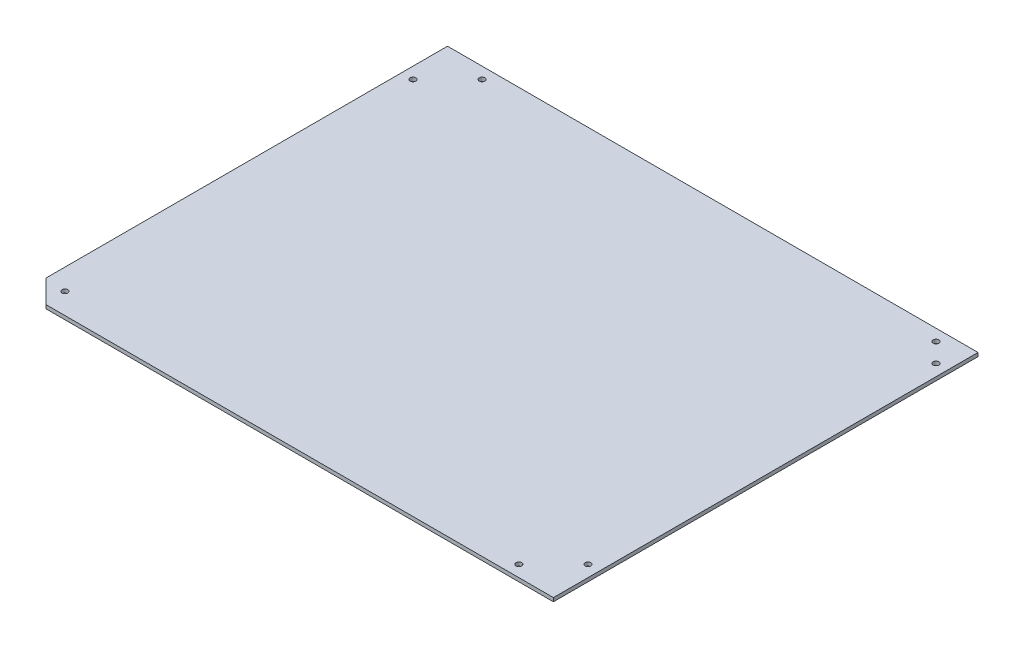
ISO-10303-21;
HEADER;
FILE_DESCRIPTION(('STEP AP214'),'2;1');
FILE_NAME('part.step','',(''),(''),'','','');
FILE_SCHEMA(('AUTOMOTIVE_DESIGN { 1 0 10303 214 1 1 1 1 }'));
ENDSEC;
DATA;
#1=APPLICATION_CONTEXT('core data for automotive mechanical design processes');
#2=APPLICATION_PROTOCOL_DEFINITION('international standard','automotive_design',2000,#1);
#3=PRODUCT_CONTEXT('',#1,'mechanical');
#4=PRODUCT('Part','Part','',(#3));
#5=PRODUCT_RELATED_PRODUCT_CATEGORY('part','',(#4));
#6=PRODUCT_DEFINITION_FORMATION('','',#4);
#7=PRODUCT_DEFINITION_CONTEXT('part definition',#1,'design');
#8=PRODUCT_DEFINITION('design','',#6,#7);
#9=PRODUCT_DEFINITION_SHAPE('','',#8);
#10=(LENGTH_UNIT() NAMED_UNIT(*) SI_UNIT(.MILLI.,.METRE.));
#11=(NAMED_UNIT(*) PLANE_ANGLE_UNIT() SI_UNIT($,.RADIAN.));
#12=(NAMED_UNIT(*) SI_UNIT($,.STERADIAN.) SOLID_ANGLE_UNIT());
#13=UNCERTAINTY_MEASURE_WITH_UNIT(LENGTH_MEASURE(1.E-05),#10,'distance_accuracy_value','');
#14=(GEOMETRIC_REPRESENTATION_CONTEXT(3) GLOBAL_UNCERTAINTY_ASSIGNED_CONTEXT((#13)) GLOBAL_UNIT_ASSIGNED_CONTEXT((#10,
#11,#12)) REPRESENTATION_CONTEXT('',''));
#15=CARTESIAN_POINT('',(0.,0.,0.));
#16=DIRECTION('',(0.,0.,1.));
#17=DIRECTION('',(1.,0.,0.));
#18=AXIS2_PLACEMENT_3D('',#15,#16,#17);
#19=CARTESIAN_POINT('',(-295.,446.825,-128.396227551465));
#20=DIRECTION('',(1.,0.,0.));
#21=DIRECTION('',(0.,0.,-1.));
#22=AXIS2_PLACEMENT_3D('',#19,#20,#21);
#23=PLANE('',#22);
#24=DIRECTION('',(0.,0.,-1.));
#25=VECTOR('',#24,1.);
#26=CARTESIAN_POINT('',(-295.,446.825,-128.396227551465));
#27=LINE('',#26,#25);
#28=CARTESIAN_POINT('',(-295.,446.825,220.));
#29=VERTEX_POINT('',#28);
#30=CARTESIAN_POINT('',(-295.,446.825,-128.396227551465));
#31=VERTEX_POINT('',#30);
#32=EDGE_CURVE('E81',#29,#31,#27,.T.);
#33=ORIENTED_EDGE('',*,*,#32,.F.);
#34=DIRECTION('',(0.,1.,0.));
#35=VECTOR('',#34,1.);
#36=CARTESIAN_POINT('',(-295.,446.825,220.));
#37=LINE('',#36,#35);
#38=CARTESIAN_POINT('',(-295.,450.,220.));
#39=VERTEX_POINT('',#38);
#40=EDGE_CURVE('E104',#29,#39,#37,.T.);
#41=ORIENTED_EDGE('',*,*,#40,.T.);
#42=DIRECTION('',(0.,0.,-1.));
#43=VECTOR('',#42,1.);
#44=CARTESIAN_POINT('',(-295.,450.,-128.396227551465));
#45=LINE('',#44,#43);
#46=CARTESIAN_POINT('',(-295.,450.,-128.396227551465));
#47=VERTEX_POINT('',#46);
#48=EDGE_CURVE('E102',#39,#47,#45,.T.);
#49=ORIENTED_EDGE('',*,*,#48,.T.);
#50=DIRECTION('',(0.,1.,0.));
#51=VECTOR('',#50,1.);
#52=CARTESIAN_POINT('',(-295.,446.825,-128.396227551465));
#53=LINE('',#52,#51);
#54=EDGE_CURVE('E96',#31,#47,#53,.T.);
#55=ORIENTED_EDGE('',*,*,#54,.F.);
#56=EDGE_LOOP('',(#33,#41,#49,#55));
#57=FACE_BOUND('',#56,.T.);
#58=ADVANCED_FACE('F33',(#57),#23,.F.);
#59=CARTESIAN_POINT('',(-295.,446.825,-128.396227551465));
#60=DIRECTION('',(0.,0.,1.));
#61=DIRECTION('',(1.,0.,0.));
#62=AXIS2_PLACEMENT_3D('',#59,#60,#61);
#63=PLANE('',#62);
#64=DIRECTION('',(1.,0.,0.));
#65=VECTOR('',#64,1.);
#66=CARTESIAN_POINT('',(-295.,450.,-128.396227551465));
#67=LINE('',#66,#65);
#68=CARTESIAN_POINT('',(165.271732748,450.,-128.396227551465));
#69=VERTEX_POINT('',#68);
#70=EDGE_CURVE('E153',#47,#69,#67,.T.);
#71=ORIENTED_EDGE('',*,*,#70,.T.);
#72=DIRECTION('',(0.,1.,0.));
#73=VECTOR('',#72,1.);
#74=CARTESIAN_POINT('',(165.271732748,446.825,-128.396227551465));
#75=LINE('',#74,#73);
#76=CARTESIAN_POINT('',(165.271732748,446.825,-128.396227551465));
#77=VERTEX_POINT('',#76);
#78=EDGE_CURVE('E98',#77,#69,#75,.T.);
#79=ORIENTED_EDGE('',*,*,#78,.F.);
#80=DIRECTION('',(1.,0.,0.));
#81=VECTOR('',#80,1.);
#82=CARTESIAN_POINT('',(-295.,446.825,-128.396227551465));
#83=LINE('',#82,#81);
#84=EDGE_CURVE('E84',#31,#77,#83,.T.);
#85=ORIENTED_EDGE('',*,*,#84,.F.);
#86=ORIENTED_EDGE('',*,*,#54,.T.);
#87=EDGE_LOOP('',(#71,#79,#85,#86));
#88=FACE_BOUND('',#87,.T.);
#89=ADVANCED_FACE('F95',(#88),#63,.F.);
#90=CARTESIAN_POINT('',(165.271732748,446.825,-128.396227551465));
#91=DIRECTION('',(-1.,0.,0.));
#92=DIRECTION('',(0.,0.,1.));
#93=AXIS2_PLACEMENT_3D('',#90,#91,#92);
#94=PLANE('',#93);
#95=DIRECTION('',(0.,0.,1.));
#96=VECTOR('',#95,1.);
#97=CARTESIAN_POINT('',(165.271732748,450.,-128.396227551465));
#98=LINE('',#97,#96);
#99=CARTESIAN_POINT('',(165.271732748,450.,240.));
#100=VERTEX_POINT('',#99);
#101=EDGE_CURVE('E155',#69,#100,#98,.T.);
#102=ORIENTED_EDGE('',*,*,#101,.T.);
#103=DIRECTION('',(0.,1.,0.));
#104=VECTOR('',#103,1.);
#105=CARTESIAN_POINT('',(165.271732748,446.825,240.));
#106=LINE('',#105,#104);
#107=CARTESIAN_POINT('',(165.271732748,446.825,240.));
#108=VERTEX_POINT('',#107);
#109=EDGE_CURVE('E107',#108,#100,#106,.T.);
#110=ORIENTED_EDGE('',*,*,#109,.F.);
#111=DIRECTION('',(0.,0.,1.));
#112=VECTOR('',#111,1.);
#113=CARTESIAN_POINT('',(165.271732748,446.825,-128.396227551465));
#114=LINE('',#113,#112);
#115=EDGE_CURVE('E100',#77,#108,#114,.T.);
#116=ORIENTED_EDGE('',*,*,#115,.F.);
#117=ORIENTED_EDGE('',*,*,#78,.T.);
#118=EDGE_LOOP('',(#102,#110,#116,#117));
#119=FACE_BOUND('',#118,.T.);
#120=ADVANCED_FACE('F163',(#119),#94,.F.);
#121=CARTESIAN_POINT('',(-295.,446.825,240.));
#122=DIRECTION('',(0.,0.,-1.));
#123=DIRECTION('',(-1.,0.,0.));
#124=AXIS2_PLACEMENT_3D('',#121,#122,#123);
#125=PLANE('',#124);
#126=DIRECTION('',(-1.,0.,0.));
#127=VECTOR('',#126,1.);
#128=CARTESIAN_POINT('',(-295.,450.,240.));
#129=LINE('',#128,#127);
#130=CARTESIAN_POINT('',(-275.,450.,240.));
#131=VERTEX_POINT('',#130);
#132=EDGE_CURVE('E91',#100,#131,#129,.T.);
#133=ORIENTED_EDGE('',*,*,#132,.T.);
#134=DIRECTION('',(0.,-1.,0.));
#135=VECTOR('',#134,1.);
#136=CARTESIAN_POINT('',(-275.,446.825,240.));
#137=LINE('',#136,#135);
#138=CARTESIAN_POINT('',(-275.,446.825,240.));
#139=VERTEX_POINT('',#138);
#140=EDGE_CURVE('E42',#131,#139,#137,.T.);
#141=ORIENTED_EDGE('',*,*,#140,.T.);
#142=DIRECTION('',(-1.,0.,0.));
#143=VECTOR('',#142,1.);
#144=CARTESIAN_POINT('',(-295.,446.825,240.));
#145=LINE('',#144,#143);
#146=EDGE_CURVE('E150',#108,#139,#145,.T.);
#147=ORIENTED_EDGE('',*,*,#146,.F.);
#148=ORIENTED_EDGE('',*,*,#109,.T.);
#149=EDGE_LOOP('',(#133,#141,#147,#148));
#150=FACE_BOUND('',#149,.T.);
#151=ADVANCED_FACE('F159',(#150),#125,.F.);
#152=CARTESIAN_POINT('',(0.,446.825,0.));
#153=DIRECTION('',(0.,1.,0.));
#154=DIRECTION('',(0.,0.,1.));
#155=AXIS2_PLACEMENT_3D('',#152,#153,#154);
#156=PLANE('',#155);
#157=CARTESIAN_POINT('',(-276.782224708341,446.825,221.782224708341));
#158=DIRECTION('',(0.,1.,0.));
#159=DIRECTION('',(0.,0.,1.));
#160=AXIS2_PLACEMENT_3D('',#157,#158,#159);
#161=CIRCLE('',#160,2.50000000000002);
#162=CARTESIAN_POINT('',(-276.782224708341,446.825,224.282224708341));
#163=VERTEX_POINT('',#162);
#164=EDGE_CURVE('E146',#163,#163,#161,.T.);
#165=ORIENTED_EDGE('',*,*,#164,.T.);
#166=EDGE_LOOP('',(#165));
#167=FACE_BOUND('',#166,.T.);
#168=CARTESIAN_POINT('',(125.271732748,446.825,230.));
#169=DIRECTION('',(0.,1.,0.));
#170=DIRECTION('',(0.,0.,1.));
#171=AXIS2_PLACEMENT_3D('',#168,#169,#170);
#172=CIRCLE('',#171,2.5);
#173=CARTESIAN_POINT('',(125.271732748,446.825,232.5));
#174=VERTEX_POINT('',#173);
#175=EDGE_CURVE('E134',#174,#174,#172,.T.);
#176=ORIENTED_EDGE('',*,*,#175,.T.);
#177=EDGE_LOOP('',(#176));
#178=FACE_BOUND('',#177,.T.);
#179=CARTESIAN_POINT('',(155.271732748,446.825,200.));
#180=DIRECTION('',(0.,1.,0.));
#181=DIRECTION('',(0.,0.,1.));
#182=AXIS2_PLACEMENT_3D('',#179,#180,#181);
#183=CIRCLE('',#182,2.5);
#184=CARTESIAN_POINT('',(155.271732748,446.825,202.5));
#185=VERTEX_POINT('',#184);
#186=EDGE_CURVE('E131',#185,#185,#183,.T.);
#187=ORIENTED_EDGE('',*,*,#186,.T.);
#188=EDGE_LOOP('',(#187));
#189=FACE_BOUND('',#188,.T.);
#190=CARTESIAN_POINT('',(155.271732748,446.825,-101.960676968146));
#191=DIRECTION('',(0.,1.,0.));
#192=DIRECTION('',(0.,0.,1.));
#193=AXIS2_PLACEMENT_3D('',#190,#191,#192);
#194=CIRCLE('',#193,2.5);
#195=CARTESIAN_POINT('',(155.271732748,446.825,-99.4606769681461));
#196=VERTEX_POINT('',#195);
#197=EDGE_CURVE('E128',#196,#196,#194,.T.);
#198=ORIENTED_EDGE('',*,*,#197,.T.);
#199=EDGE_LOOP('',(#198));
#200=FACE_BOUND('',#199,.T.);
#201=CARTESIAN_POINT('',(138.836182164682,446.825,-118.396227551465));
#202=DIRECTION('',(0.,1.,0.));
#203=DIRECTION('',(0.,0.,1.));
#204=AXIS2_PLACEMENT_3D('',#201,#202,#203);
#205=CIRCLE('',#204,2.5);
#206=CARTESIAN_POINT('',(138.836182164682,446.825,-115.896227551465));
#207=VERTEX_POINT('',#206);
#208=EDGE_CURVE('E124',#207,#207,#205,.T.);
#209=ORIENTED_EDGE('',*,*,#208,.T.);
#210=EDGE_LOOP('',(#209));
#211=FACE_BOUND('',#210,.T.);
#212=CARTESIAN_POINT('',(-285.,446.825,-88.3962275514643));
#213=DIRECTION('',(0.,1.,0.));
#214=DIRECTION('',(0.,0.,1.));
#215=AXIS2_PLACEMENT_3D('',#212,#213,#214);
#216=CIRCLE('',#215,2.50000000000002);
#217=CARTESIAN_POINT('',(-285.,446.825,-85.8962275514643));
#218=VERTEX_POINT('',#217);
#219=EDGE_CURVE('E120',#218,#218,#216,.T.);
#220=ORIENTED_EDGE('',*,*,#219,.T.);
#221=EDGE_LOOP('',(#220));
#222=FACE_BOUND('',#221,.T.);
#223=CARTESIAN_POINT('',(-255.,446.825,-118.396227551464));
#224=DIRECTION('',(0.,1.,0.));
#225=DIRECTION('',(0.,0.,1.));
#226=AXIS2_PLACEMENT_3D('',#223,#224,#225);
#227=CIRCLE('',#226,2.50000000000002);
#228=CARTESIAN_POINT('',(-255.,446.825,-115.896227551464));
#229=VERTEX_POINT('',#228);
#230=EDGE_CURVE('E116',#229,#229,#227,.T.);
#231=ORIENTED_EDGE('',*,*,#230,.T.);
#232=EDGE_LOOP('',(#231));
#233=FACE_BOUND('',#232,.T.);
#234=ORIENTED_EDGE('',*,*,#146,.T.);
#235=DIRECTION('',(0.707106781186549,0.,0.707106781186546));
#236=VECTOR('',#235,1.);
#237=CARTESIAN_POINT('',(-295.,446.825,220.));
#238=LINE('',#237,#236);
#239=EDGE_CURVE('E11',#139,#29,#238,.F.);
#240=ORIENTED_EDGE('',*,*,#239,.T.);
#241=ORIENTED_EDGE('',*,*,#32,.T.);
#242=ORIENTED_EDGE('',*,*,#84,.T.);
#243=ORIENTED_EDGE('',*,*,#115,.T.);
#244=EDGE_LOOP('',(#234,#240,#241,#242,#243));
#245=FACE_BOUND('',#244,.T.);
#246=ADVANCED_FACE('F83',(#167,#178,#189,#200,#211,#222,#233,#245),#156,.F.);
#247=CARTESIAN_POINT('',(0.,450.,0.));
#248=DIRECTION('',(0.,1.,0.));
#249=DIRECTION('',(0.,0.,1.));
#250=AXIS2_PLACEMENT_3D('',#247,#248,#249);
#251=PLANE('',#250);
#252=CARTESIAN_POINT('',(-276.782224708341,450.,221.782224708341));
#253=DIRECTION('',(0.,1.,0.));
#254=DIRECTION('',(0.,0.,1.));
#255=AXIS2_PLACEMENT_3D('',#252,#253,#254);
#256=CIRCLE('',#255,2.50000000000002);
#257=CARTESIAN_POINT('',(-276.782224708341,450.,224.282224708341));
#258=VERTEX_POINT('',#257);
#259=EDGE_CURVE('E37',#258,#258,#256,.T.);
#260=ORIENTED_EDGE('',*,*,#259,.F.);
#261=EDGE_LOOP('',(#260));
#262=FACE_BOUND('',#261,.T.);
#263=CARTESIAN_POINT('',(125.271732748,450.,230.));
#264=DIRECTION('',(0.,1.,0.));
#265=DIRECTION('',(0.,0.,1.));
#266=AXIS2_PLACEMENT_3D('',#263,#264,#265);
#267=CIRCLE('',#266,2.5);
#268=CARTESIAN_POINT('',(125.271732748,450.,232.5));
#269=VERTEX_POINT('',#268);
#270=EDGE_CURVE('E132',#269,#269,#267,.T.);
#271=ORIENTED_EDGE('',*,*,#270,.F.);
#272=EDGE_LOOP('',(#271));
#273=FACE_BOUND('',#272,.T.);
#274=CARTESIAN_POINT('',(155.271732748,450.,200.));
#275=DIRECTION('',(0.,1.,0.));
#276=DIRECTION('',(0.,0.,1.));
#277=AXIS2_PLACEMENT_3D('',#274,#275,#276);
#278=CIRCLE('',#277,2.5);
#279=CARTESIAN_POINT('',(155.271732748,450.,202.5));
#280=VERTEX_POINT('',#279);
#281=EDGE_CURVE('E129',#280,#280,#278,.T.);
#282=ORIENTED_EDGE('',*,*,#281,.F.);
#283=EDGE_LOOP('',(#282));
#284=FACE_BOUND('',#283,.T.);
#285=CARTESIAN_POINT('',(155.271732748,450.,-101.960676968146));
#286=DIRECTION('',(0.,1.,0.));
#287=DIRECTION('',(0.,0.,1.));
#288=AXIS2_PLACEMENT_3D('',#285,#286,#287);
#289=CIRCLE('',#288,2.5);
#290=CARTESIAN_POINT('',(155.271732748,450.,-99.4606769681461));
#291=VERTEX_POINT('',#290);
#292=EDGE_CURVE('E125',#291,#291,#289,.T.);
#293=ORIENTED_EDGE('',*,*,#292,.F.);
#294=EDGE_LOOP('',(#293));
#295=FACE_BOUND('',#294,.T.);
#296=CARTESIAN_POINT('',(138.836182164682,450.,-118.396227551465));
#297=DIRECTION('',(0.,1.,0.));
#298=DIRECTION('',(0.,0.,1.));
#299=AXIS2_PLACEMENT_3D('',#296,#297,#298);
#300=CIRCLE('',#299,2.5);
#301=CARTESIAN_POINT('',(138.836182164682,450.,-115.896227551465));
#302=VERTEX_POINT('',#301);
#303=EDGE_CURVE('E121',#302,#302,#300,.T.);
#304=ORIENTED_EDGE('',*,*,#303,.F.);
#305=EDGE_LOOP('',(#304));
#306=FACE_BOUND('',#305,.T.);
#307=CARTESIAN_POINT('',(-285.,450.,-88.3962275514643));
#308=DIRECTION('',(0.,1.,0.));
#309=DIRECTION('',(0.,0.,1.));
#310=AXIS2_PLACEMENT_3D('',#307,#308,#309);
#311=CIRCLE('',#310,2.50000000000002);
#312=CARTESIAN_POINT('',(-285.,450.,-85.8962275514643));
#313=VERTEX_POINT('',#312);
#314=EDGE_CURVE('E117',#313,#313,#311,.T.);
#315=ORIENTED_EDGE('',*,*,#314,.F.);
#316=EDGE_LOOP('',(#315));
#317=FACE_BOUND('',#316,.T.);
#318=CARTESIAN_POINT('',(-255.,450.,-118.396227551464));
#319=DIRECTION('',(0.,1.,0.));
#320=DIRECTION('',(0.,0.,1.));
#321=AXIS2_PLACEMENT_3D('',#318,#319,#320);
#322=CIRCLE('',#321,2.50000000000002);
#323=CARTESIAN_POINT('',(-255.,450.,-115.896227551464));
#324=VERTEX_POINT('',#323);
#325=EDGE_CURVE('E113',#324,#324,#322,.T.);
#326=ORIENTED_EDGE('',*,*,#325,.F.);
#327=EDGE_LOOP('',(#326));
#328=FACE_BOUND('',#327,.T.);
#329=ORIENTED_EDGE('',*,*,#48,.F.);
#330=DIRECTION('',(-0.707106781186549,0.,-0.707106781186546));
#331=VECTOR('',#330,1.);
#332=CARTESIAN_POINT('',(-257.499999999999,450.,257.500000000001));
#333=LINE('',#332,#331);
#334=EDGE_CURVE('E57',#39,#131,#333,.F.);
#335=ORIENTED_EDGE('',*,*,#334,.T.);
#336=ORIENTED_EDGE('',*,*,#132,.F.);
#337=ORIENTED_EDGE('',*,*,#101,.F.);
#338=ORIENTED_EDGE('',*,*,#70,.F.);
#339=EDGE_LOOP('',(#329,#335,#336,#337,#338));
#340=FACE_BOUND('',#339,.T.);
#341=ADVANCED_FACE('F162',(#262,#273,#284,#295,#306,#317,#328,#340),#251,.T.);
#342=CARTESIAN_POINT('',(-295.,446.825,220.));
#343=DIRECTION('',(0.707106781186545,0.,-0.707106781186549));
#344=DIRECTION('',(0.,1.,0.));
#345=AXIS2_PLACEMENT_3D('',#342,#343,#344);
#346=PLANE('',#345);
#347=ORIENTED_EDGE('',*,*,#239,.F.);
#348=ORIENTED_EDGE('',*,*,#140,.F.);
#349=ORIENTED_EDGE('',*,*,#334,.F.);
#350=ORIENTED_EDGE('',*,*,#40,.F.);
#351=EDGE_LOOP('',(#347,#348,#349,#350));
#352=FACE_BOUND('',#351,.T.);
#353=ADVANCED_FACE('F35',(#352),#346,.F.);
#354=CARTESIAN_POINT('',(-255.,423.2,-118.396227551464));
#355=DIRECTION('',(0.,1.,0.));
#356=DIRECTION('',(0.,0.,1.));
#357=AXIS2_PLACEMENT_3D('',#354,#355,#356);
#358=CYLINDRICAL_SURFACE('',#357,2.50000000000002);
#359=ORIENTED_EDGE('',*,*,#325,.T.);
#360=EDGE_LOOP('',(#359));
#361=FACE_BOUND('',#360,.T.);
#362=ORIENTED_EDGE('',*,*,#230,.F.);
#363=EDGE_LOOP('',(#362));
#364=FACE_BOUND('',#363,.T.);
#365=ADVANCED_FACE('F166',(#361,#364),#358,.F.);
#366=CARTESIAN_POINT('',(-285.,423.2,-88.3962275514643));
#367=DIRECTION('',(0.,1.,0.));
#368=DIRECTION('',(0.,0.,1.));
#369=AXIS2_PLACEMENT_3D('',#366,#367,#368);
#370=CYLINDRICAL_SURFACE('',#369,2.50000000000002);
#371=ORIENTED_EDGE('',*,*,#314,.T.);
#372=EDGE_LOOP('',(#371));
#373=FACE_BOUND('',#372,.T.);
#374=ORIENTED_EDGE('',*,*,#219,.F.);
#375=EDGE_LOOP('',(#374));
#376=FACE_BOUND('',#375,.T.);
#377=ADVANCED_FACE('F171',(#373,#376),#370,.F.);
#378=CARTESIAN_POINT('',(138.836182164682,423.2,-118.396227551465));
#379=DIRECTION('',(0.,1.,0.));
#380=DIRECTION('',(0.,0.,1.));
#381=AXIS2_PLACEMENT_3D('',#378,#379,#380);
#382=CYLINDRICAL_SURFACE('',#381,2.5);
#383=ORIENTED_EDGE('',*,*,#303,.T.);
#384=EDGE_LOOP('',(#383));
#385=FACE_BOUND('',#384,.T.);
#386=ORIENTED_EDGE('',*,*,#208,.F.);
#387=EDGE_LOOP('',(#386));
#388=FACE_BOUND('',#387,.T.);
#389=ADVANCED_FACE('F191',(#385,#388),#382,.F.);
#390=CARTESIAN_POINT('',(155.271732748,423.2,-101.960676968146));
#391=DIRECTION('',(0.,1.,0.));
#392=DIRECTION('',(0.,0.,1.));
#393=AXIS2_PLACEMENT_3D('',#390,#391,#392);
#394=CYLINDRICAL_SURFACE('',#393,2.5);
#395=ORIENTED_EDGE('',*,*,#292,.T.);
#396=EDGE_LOOP('',(#395));
#397=FACE_BOUND('',#396,.T.);
#398=ORIENTED_EDGE('',*,*,#197,.F.);
#399=EDGE_LOOP('',(#398));
#400=FACE_BOUND('',#399,.T.);
#401=ADVANCED_FACE('F195',(#397,#400),#394,.F.);
#402=CARTESIAN_POINT('',(155.271732748,423.2,200.));
#403=DIRECTION('',(0.,1.,0.));
#404=DIRECTION('',(0.,0.,1.));
#405=AXIS2_PLACEMENT_3D('',#402,#403,#404);
#406=CYLINDRICAL_SURFACE('',#405,2.5);
#407=ORIENTED_EDGE('',*,*,#281,.T.);
#408=EDGE_LOOP('',(#407));
#409=FACE_BOUND('',#408,.T.);
#410=ORIENTED_EDGE('',*,*,#186,.F.);
#411=EDGE_LOOP('',(#410));
#412=FACE_BOUND('',#411,.T.);
#413=ADVANCED_FACE('F199',(#409,#412),#406,.F.);
#414=CARTESIAN_POINT('',(125.271732748,423.2,230.));
#415=DIRECTION('',(0.,1.,0.));
#416=DIRECTION('',(0.,0.,1.));
#417=AXIS2_PLACEMENT_3D('',#414,#415,#416);
#418=CYLINDRICAL_SURFACE('',#417,2.5);
#419=ORIENTED_EDGE('',*,*,#270,.T.);
#420=EDGE_LOOP('',(#419));
#421=FACE_BOUND('',#420,.T.);
#422=ORIENTED_EDGE('',*,*,#175,.F.);
#423=EDGE_LOOP('',(#422));
#424=FACE_BOUND('',#423,.T.);
#425=ADVANCED_FACE('F203',(#421,#424),#418,.F.);
#426=CARTESIAN_POINT('',(-276.782224708341,423.2,221.782224708341));
#427=DIRECTION('',(0.,1.,0.));
#428=DIRECTION('',(0.,0.,1.));
#429=AXIS2_PLACEMENT_3D('',#426,#427,#428);
#430=CYLINDRICAL_SURFACE('',#429,2.50000000000002);
#431=ORIENTED_EDGE('',*,*,#259,.T.);
#432=EDGE_LOOP('',(#431));
#433=FACE_BOUND('',#432,.T.);
#434=ORIENTED_EDGE('',*,*,#164,.F.);
#435=EDGE_LOOP('',(#434));
#436=FACE_BOUND('',#435,.T.);
#437=ADVANCED_FACE('F207',(#433,#436),#430,.F.);
#438=CLOSED_SHELL('',(#58,#89,#120,#151,#246,#341,#353,#365,#377,#389,#401,#413,#425,#437));
#439=MANIFOLD_SOLID_BREP('B2',#438);
#440=ADVANCED_BREP_SHAPE_REPRESENTATION('',(#18,#439),#14);
#441=SHAPE_DEFINITION_REPRESENTATION(#9,#440);
ENDSEC;
END-ISO-10303-21;
